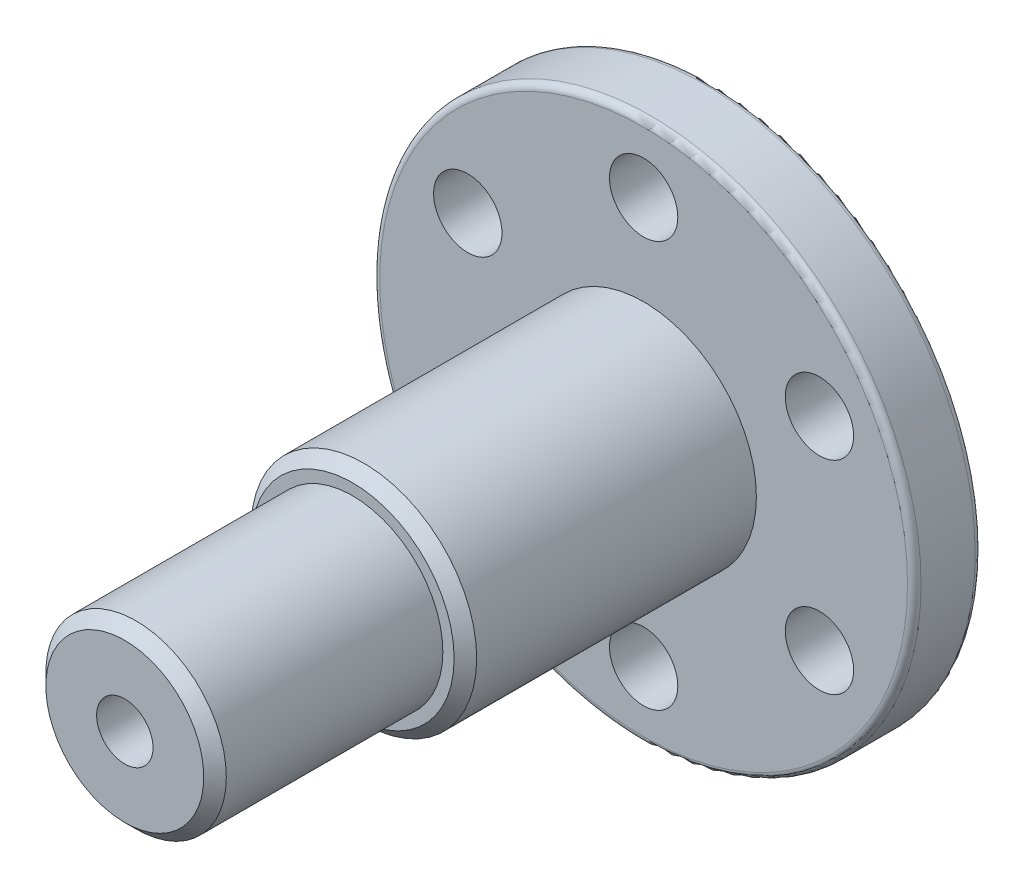
ISO-10303-21;
HEADER;
FILE_DESCRIPTION(('STEP AP214'),'2;1');
FILE_NAME('part.step','',(''),(''),'','','');
FILE_SCHEMA(('AUTOMOTIVE_DESIGN { 1 0 10303 214 1 1 1 1 }'));
ENDSEC;
DATA;
#1=APPLICATION_CONTEXT('core data for automotive mechanical design processes');
#2=APPLICATION_PROTOCOL_DEFINITION('international standard','automotive_design',2000,#1);
#3=PRODUCT_CONTEXT('',#1,'mechanical');
#4=PRODUCT('Part','Part','',(#3));
#5=PRODUCT_RELATED_PRODUCT_CATEGORY('part','',(#4));
#6=PRODUCT_DEFINITION_FORMATION('','',#4);
#7=PRODUCT_DEFINITION_CONTEXT('part definition',#1,'design');
#8=PRODUCT_DEFINITION('design','',#6,#7);
#9=PRODUCT_DEFINITION_SHAPE('','',#8);
#10=(LENGTH_UNIT() NAMED_UNIT(*) SI_UNIT(.MILLI.,.METRE.));
#11=(NAMED_UNIT(*) PLANE_ANGLE_UNIT() SI_UNIT($,.RADIAN.));
#12=(NAMED_UNIT(*) SI_UNIT($,.STERADIAN.) SOLID_ANGLE_UNIT());
#13=UNCERTAINTY_MEASURE_WITH_UNIT(LENGTH_MEASURE(1.E-05),#10,'distance_accuracy_value','');
#14=(GEOMETRIC_REPRESENTATION_CONTEXT(3) GLOBAL_UNCERTAINTY_ASSIGNED_CONTEXT((#13)) GLOBAL_UNIT_ASSIGNED_CONTEXT((#10,
#11,#12)) REPRESENTATION_CONTEXT('',''));
#15=CARTESIAN_POINT('',(0.,0.,0.));
#16=DIRECTION('',(0.,0.,1.));
#17=DIRECTION('',(1.,0.,0.));
#18=AXIS2_PLACEMENT_3D('',#15,#16,#17);
#19=CARTESIAN_POINT('',(0.,0.,26.));
#20=DIRECTION('',(0.,0.,-1.));
#21=DIRECTION('',(-1.,0.,0.));
#22=AXIS2_PLACEMENT_3D('',#19,#20,#21);
#23=CYLINDRICAL_SURFACE('',#22,5.);
#24=CARTESIAN_POINT('',(0.,0.,15.4));
#25=DIRECTION('',(0.,0.,1.));
#26=DIRECTION('',(1.,0.,0.));
#27=AXIS2_PLACEMENT_3D('',#24,#25,#26);
#28=CIRCLE('',#27,5.);
#29=CARTESIAN_POINT('',(5.,0.,15.4));
#30=VERTEX_POINT('',#29);
#31=EDGE_CURVE('E116',#30,#30,#28,.F.);
#32=ORIENTED_EDGE('',*,*,#31,.T.);
#33=EDGE_LOOP('',(#32));
#34=FACE_BOUND('',#33,.T.);
#35=CARTESIAN_POINT('',(0.,0.,3.));
#36=DIRECTION('',(0.,0.,1.));
#37=DIRECTION('',(1.,0.,0.));
#38=AXIS2_PLACEMENT_3D('',#35,#36,#37);
#39=CIRCLE('',#38,5.);
#40=CARTESIAN_POINT('',(5.,0.,3.));
#41=VERTEX_POINT('',#40);
#42=EDGE_CURVE('E70',#41,#41,#39,.T.);
#43=ORIENTED_EDGE('',*,*,#42,.T.);
#44=EDGE_LOOP('',(#43));
#45=FACE_BOUND('',#44,.T.);
#46=ADVANCED_FACE('F47',(#34,#45),#23,.T.);
#47=CARTESIAN_POINT('',(0.,0.,3.));
#48=DIRECTION('',(0.,0.,1.));
#49=DIRECTION('',(1.,0.,0.));
#50=AXIS2_PLACEMENT_3D('',#47,#48,#49);
#51=PLANE('',#50);
#52=CARTESIAN_POINT('',(0.,0.,3.));
#53=DIRECTION('',(0.,0.,1.));
#54=DIRECTION('',(1.,0.,0.));
#55=AXIS2_PLACEMENT_3D('',#52,#53,#54);
#56=CIRCLE('',#55,11.7);
#57=CARTESIAN_POINT('',(11.7,0.,3.));
#58=VERTEX_POINT('',#57);
#59=EDGE_CURVE('E13',#58,#58,#56,.T.);
#60=ORIENTED_EDGE('',*,*,#59,.T.);
#61=EDGE_LOOP('',(#60));
#62=FACE_BOUND('',#61,.T.);
#63=ORIENTED_EDGE('',*,*,#42,.F.);
#64=EDGE_LOOP('',(#63));
#65=FACE_BOUND('',#64,.T.);
#66=CARTESIAN_POINT('',(-7.79422863405995,-4.5,3.));
#67=DIRECTION('',(0.,0.,1.));
#68=DIRECTION('',(1.,0.,0.));
#69=AXIS2_PLACEMENT_3D('',#66,#67,#68);
#70=CIRCLE('',#69,1.5149999999998);
#71=CARTESIAN_POINT('',(-6.27922863406015,-4.5,3.));
#72=VERTEX_POINT('',#71);
#73=EDGE_CURVE('E84',#72,#72,#70,.T.);
#74=ORIENTED_EDGE('',*,*,#73,.F.);
#75=EDGE_LOOP('',(#74));
#76=FACE_BOUND('',#75,.T.);
#77=CARTESIAN_POINT('',(7.79422863405986,-4.50000000000014,3.));
#78=DIRECTION('',(0.,0.,1.));
#79=DIRECTION('',(1.,0.,0.));
#80=AXIS2_PLACEMENT_3D('',#77,#78,#79);
#81=CIRCLE('',#80,1.515);
#82=CARTESIAN_POINT('',(9.30922863405986,-4.50000000000014,3.));
#83=VERTEX_POINT('',#82);
#84=EDGE_CURVE('E96',#83,#83,#81,.T.);
#85=ORIENTED_EDGE('',*,*,#84,.F.);
#86=EDGE_LOOP('',(#85));
#87=FACE_BOUND('',#86,.T.);
#88=CARTESIAN_POINT('',(0.,9.,3.));
#89=DIRECTION('',(0.,0.,1.));
#90=DIRECTION('',(1.,0.,0.));
#91=AXIS2_PLACEMENT_3D('',#88,#89,#90);
#92=CIRCLE('',#91,1.515);
#93=CARTESIAN_POINT('',(1.515,9.,3.));
#94=VERTEX_POINT('',#93);
#95=EDGE_CURVE('E108',#94,#94,#92,.T.);
#96=ORIENTED_EDGE('',*,*,#95,.F.);
#97=EDGE_LOOP('',(#96));
#98=FACE_BOUND('',#97,.T.);
#99=CARTESIAN_POINT('',(7.79422863406002,4.49999999999987,3.));
#100=DIRECTION('',(0.,0.,1.));
#101=DIRECTION('',(1.,0.,0.));
#102=AXIS2_PLACEMENT_3D('',#99,#100,#101);
#103=CIRCLE('',#102,1.515);
#104=CARTESIAN_POINT('',(9.30922863406002,4.49999999999987,3.));
#105=VERTEX_POINT('',#104);
#106=EDGE_CURVE('E102',#105,#105,#103,.T.);
#107=ORIENTED_EDGE('',*,*,#106,.F.);
#108=EDGE_LOOP('',(#107));
#109=FACE_BOUND('',#108,.T.);
#110=CARTESIAN_POINT('',(-1.87350135405495E-13,-9.,3.));
#111=DIRECTION('',(0.,0.,1.));
#112=DIRECTION('',(1.,0.,0.));
#113=AXIS2_PLACEMENT_3D('',#110,#111,#112);
#114=CIRCLE('',#113,1.515);
#115=CARTESIAN_POINT('',(1.51499999999981,-9.,3.));
#116=VERTEX_POINT('',#115);
#117=EDGE_CURVE('E90',#116,#116,#114,.T.);
#118=ORIENTED_EDGE('',*,*,#117,.F.);
#119=EDGE_LOOP('',(#118));
#120=FACE_BOUND('',#119,.T.);
#121=CARTESIAN_POINT('',(-7.7942286340599,4.50000000000009,3.));
#122=DIRECTION('',(0.,0.,1.));
#123=DIRECTION('',(1.,0.,0.));
#124=AXIS2_PLACEMENT_3D('',#121,#122,#123);
#125=CIRCLE('',#124,1.515);
#126=CARTESIAN_POINT('',(-6.2792286340599,4.50000000000009,3.));
#127=VERTEX_POINT('',#126);
#128=EDGE_CURVE('E78',#127,#127,#125,.T.);
#129=ORIENTED_EDGE('',*,*,#128,.F.);
#130=EDGE_LOOP('',(#129));
#131=FACE_BOUND('',#130,.T.);
#132=ADVANCED_FACE('F153',(#62,#65,#76,#87,#98,#109,#120,#131),#51,.T.);
#133=CARTESIAN_POINT('',(0.,0.,0.));
#134=DIRECTION('',(0.,0.,1.));
#135=DIRECTION('',(1.,0.,0.));
#136=AXIS2_PLACEMENT_3D('',#133,#134,#135);
#137=PLANE('',#136);
#138=CARTESIAN_POINT('',(0.,0.,0.));
#139=DIRECTION('',(0.,0.,1.));
#140=DIRECTION('',(1.,0.,0.));
#141=AXIS2_PLACEMENT_3D('',#138,#139,#140);
#142=CIRCLE('',#141,11.7);
#143=CARTESIAN_POINT('',(11.7,0.,0.));
#144=VERTEX_POINT('',#143);
#145=EDGE_CURVE('E54',#144,#144,#142,.F.);
#146=ORIENTED_EDGE('',*,*,#145,.T.);
#147=EDGE_LOOP('',(#146));
#148=FACE_BOUND('',#147,.T.);
#149=CARTESIAN_POINT('',(0.,9.,0.));
#150=DIRECTION('',(0.,0.,1.));
#151=DIRECTION('',(1.,0.,0.));
#152=AXIS2_PLACEMENT_3D('',#149,#150,#151);
#153=CIRCLE('',#152,1.515);
#154=CARTESIAN_POINT('',(1.515,9.,0.));
#155=VERTEX_POINT('',#154);
#156=EDGE_CURVE('E105',#155,#155,#153,.T.);
#157=ORIENTED_EDGE('',*,*,#156,.T.);
#158=EDGE_LOOP('',(#157));
#159=FACE_BOUND('',#158,.T.);
#160=CARTESIAN_POINT('',(7.79422863406002,4.49999999999987,0.));
#161=DIRECTION('',(0.,0.,1.));
#162=DIRECTION('',(1.,0.,0.));
#163=AXIS2_PLACEMENT_3D('',#160,#161,#162);
#164=CIRCLE('',#163,1.515);
#165=CARTESIAN_POINT('',(9.30922863406002,4.49999999999987,0.));
#166=VERTEX_POINT('',#165);
#167=EDGE_CURVE('E99',#166,#166,#164,.T.);
#168=ORIENTED_EDGE('',*,*,#167,.T.);
#169=EDGE_LOOP('',(#168));
#170=FACE_BOUND('',#169,.T.);
#171=CARTESIAN_POINT('',(7.79422863405986,-4.50000000000014,0.));
#172=DIRECTION('',(0.,0.,1.));
#173=DIRECTION('',(1.,0.,0.));
#174=AXIS2_PLACEMENT_3D('',#171,#172,#173);
#175=CIRCLE('',#174,1.515);
#176=CARTESIAN_POINT('',(9.30922863405986,-4.50000000000014,0.));
#177=VERTEX_POINT('',#176);
#178=EDGE_CURVE('E93',#177,#177,#175,.T.);
#179=ORIENTED_EDGE('',*,*,#178,.T.);
#180=EDGE_LOOP('',(#179));
#181=FACE_BOUND('',#180,.T.);
#182=CARTESIAN_POINT('',(-1.87350135405495E-13,-9.,0.));
#183=DIRECTION('',(0.,0.,1.));
#184=DIRECTION('',(1.,0.,0.));
#185=AXIS2_PLACEMENT_3D('',#182,#183,#184);
#186=CIRCLE('',#185,1.515);
#187=CARTESIAN_POINT('',(1.51499999999981,-9.,0.));
#188=VERTEX_POINT('',#187);
#189=EDGE_CURVE('E87',#188,#188,#186,.T.);
#190=ORIENTED_EDGE('',*,*,#189,.T.);
#191=EDGE_LOOP('',(#190));
#192=FACE_BOUND('',#191,.T.);
#193=CARTESIAN_POINT('',(-7.79422863405995,-4.5,0.));
#194=DIRECTION('',(0.,0.,1.));
#195=DIRECTION('',(1.,0.,0.));
#196=AXIS2_PLACEMENT_3D('',#193,#194,#195);
#197=CIRCLE('',#196,1.5149999999998);
#198=CARTESIAN_POINT('',(-6.27922863406015,-4.5,0.));
#199=VERTEX_POINT('',#198);
#200=EDGE_CURVE('E81',#199,#199,#197,.T.);
#201=ORIENTED_EDGE('',*,*,#200,.T.);
#202=EDGE_LOOP('',(#201));
#203=FACE_BOUND('',#202,.T.);
#204=CARTESIAN_POINT('',(-7.7942286340599,4.50000000000009,0.));
#205=DIRECTION('',(0.,0.,1.));
#206=DIRECTION('',(1.,0.,0.));
#207=AXIS2_PLACEMENT_3D('',#204,#205,#206);
#208=CIRCLE('',#207,1.515);
#209=CARTESIAN_POINT('',(-6.2792286340599,4.50000000000009,0.));
#210=VERTEX_POINT('',#209);
#211=EDGE_CURVE('E77',#210,#210,#208,.T.);
#212=ORIENTED_EDGE('',*,*,#211,.T.);
#213=EDGE_LOOP('',(#212));
#214=FACE_BOUND('',#213,.T.);
#215=ADVANCED_FACE('F133',(#148,#159,#170,#181,#192,#203,#214),#137,.F.);
#216=CARTESIAN_POINT('',(0.,0.,3.));
#217=DIRECTION('',(0.,0.,-1.));
#218=DIRECTION('',(-1.,0.,0.));
#219=AXIS2_PLACEMENT_3D('',#216,#217,#218);
#220=CYLINDRICAL_SURFACE('',#219,12.);
#221=CARTESIAN_POINT('',(0.,0.,0.3));
#222=DIRECTION('',(0.,0.,1.));
#223=DIRECTION('',(1.,0.,0.));
#224=AXIS2_PLACEMENT_3D('',#221,#222,#223);
#225=CIRCLE('',#224,12.);
#226=CARTESIAN_POINT('',(12.,0.,0.3));
#227=VERTEX_POINT('',#226);
#228=EDGE_CURVE('E128',#227,#227,#225,.T.);
#229=ORIENTED_EDGE('',*,*,#228,.T.);
#230=EDGE_LOOP('',(#229));
#231=FACE_BOUND('',#230,.T.);
#232=CARTESIAN_POINT('',(0.,0.,2.7));
#233=DIRECTION('',(0.,0.,1.));
#234=DIRECTION('',(1.,0.,0.));
#235=AXIS2_PLACEMENT_3D('',#232,#233,#234);
#236=CIRCLE('',#235,12.);
#237=CARTESIAN_POINT('',(12.,0.,2.7));
#238=VERTEX_POINT('',#237);
#239=EDGE_CURVE('E125',#238,#238,#236,.F.);
#240=ORIENTED_EDGE('',*,*,#239,.T.);
#241=EDGE_LOOP('',(#240));
#242=FACE_BOUND('',#241,.T.);
#243=ADVANCED_FACE('F142',(#231,#242),#220,.T.);
#244=CARTESIAN_POINT('',(0.,9.,3.));
#245=DIRECTION('',(0.,0.,-1.));
#246=DIRECTION('',(-1.,0.,0.));
#247=AXIS2_PLACEMENT_3D('',#244,#245,#246);
#248=CYLINDRICAL_SURFACE('',#247,1.515);
#249=ORIENTED_EDGE('',*,*,#95,.T.);
#250=EDGE_LOOP('',(#249));
#251=FACE_BOUND('',#250,.T.);
#252=ORIENTED_EDGE('',*,*,#156,.F.);
#253=EDGE_LOOP('',(#252));
#254=FACE_BOUND('',#253,.T.);
#255=ADVANCED_FACE('F145',(#251,#254),#248,.F.);
#256=CARTESIAN_POINT('',(7.79422863406002,4.49999999999987,3.));
#257=DIRECTION('',(0.,0.,-1.));
#258=DIRECTION('',(-1.,0.,0.));
#259=AXIS2_PLACEMENT_3D('',#256,#257,#258);
#260=CYLINDRICAL_SURFACE('',#259,1.515);
#261=ORIENTED_EDGE('',*,*,#106,.T.);
#262=EDGE_LOOP('',(#261));
#263=FACE_BOUND('',#262,.T.);
#264=ORIENTED_EDGE('',*,*,#167,.F.);
#265=EDGE_LOOP('',(#264));
#266=FACE_BOUND('',#265,.T.);
#267=ADVANCED_FACE('F203',(#263,#266),#260,.F.);
#268=CARTESIAN_POINT('',(7.79422863405986,-4.50000000000014,3.));
#269=DIRECTION('',(0.,0.,-1.));
#270=DIRECTION('',(-1.,0.,0.));
#271=AXIS2_PLACEMENT_3D('',#268,#269,#270);
#272=CYLINDRICAL_SURFACE('',#271,1.515);
#273=ORIENTED_EDGE('',*,*,#84,.T.);
#274=EDGE_LOOP('',(#273));
#275=FACE_BOUND('',#274,.T.);
#276=ORIENTED_EDGE('',*,*,#178,.F.);
#277=EDGE_LOOP('',(#276));
#278=FACE_BOUND('',#277,.T.);
#279=ADVANCED_FACE('F199',(#275,#278),#272,.F.);
#280=CARTESIAN_POINT('',(-1.87350135405495E-13,-9.,3.));
#281=DIRECTION('',(0.,0.,-1.));
#282=DIRECTION('',(-1.,0.,0.));
#283=AXIS2_PLACEMENT_3D('',#280,#281,#282);
#284=CYLINDRICAL_SURFACE('',#283,1.515);
#285=ORIENTED_EDGE('',*,*,#117,.T.);
#286=EDGE_LOOP('',(#285));
#287=FACE_BOUND('',#286,.T.);
#288=ORIENTED_EDGE('',*,*,#189,.F.);
#289=EDGE_LOOP('',(#288));
#290=FACE_BOUND('',#289,.T.);
#291=ADVANCED_FACE('F195',(#287,#290),#284,.F.);
#292=CARTESIAN_POINT('',(-7.79422863405995,-4.5,3.));
#293=DIRECTION('',(0.,0.,-1.));
#294=DIRECTION('',(-1.,0.,0.));
#295=AXIS2_PLACEMENT_3D('',#292,#293,#294);
#296=CYLINDRICAL_SURFACE('',#295,1.5149999999998);
#297=ORIENTED_EDGE('',*,*,#73,.T.);
#298=EDGE_LOOP('',(#297));
#299=FACE_BOUND('',#298,.T.);
#300=ORIENTED_EDGE('',*,*,#200,.F.);
#301=EDGE_LOOP('',(#300));
#302=FACE_BOUND('',#301,.T.);
#303=ADVANCED_FACE('F175',(#299,#302),#296,.F.);
#304=CARTESIAN_POINT('',(-7.7942286340599,4.50000000000009,3.));
#305=DIRECTION('',(0.,0.,-1.));
#306=DIRECTION('',(-1.,0.,0.));
#307=AXIS2_PLACEMENT_3D('',#304,#305,#306);
#308=CYLINDRICAL_SURFACE('',#307,1.515);
#309=ORIENTED_EDGE('',*,*,#128,.T.);
#310=EDGE_LOOP('',(#309));
#311=FACE_BOUND('',#310,.T.);
#312=ORIENTED_EDGE('',*,*,#211,.F.);
#313=EDGE_LOOP('',(#312));
#314=FACE_BOUND('',#313,.T.);
#315=ADVANCED_FACE('F171',(#311,#314),#308,.F.);
#316=CARTESIAN_POINT('',(0.,0.,15.9));
#317=DIRECTION('',(0.,0.,1.));
#318=DIRECTION('',(1.,0.,0.));
#319=AXIS2_PLACEMENT_3D('',#316,#317,#318);
#320=PLANE('',#319);
#321=CARTESIAN_POINT('',(0.,0.,15.9));
#322=DIRECTION('',(0.,0.,1.));
#323=DIRECTION('',(1.,0.,0.));
#324=AXIS2_PLACEMENT_3D('',#321,#322,#323);
#325=CIRCLE('',#324,4.5);
#326=CARTESIAN_POINT('',(4.5,0.,15.9));
#327=VERTEX_POINT('',#326);
#328=EDGE_CURVE('E111',#327,#327,#325,.T.);
#329=ORIENTED_EDGE('',*,*,#328,.T.);
#330=EDGE_LOOP('',(#329));
#331=FACE_BOUND('',#330,.T.);
#332=CARTESIAN_POINT('',(0.,0.,15.9));
#333=DIRECTION('',(0.,0.,1.));
#334=DIRECTION('',(1.,0.,0.));
#335=AXIS2_PLACEMENT_3D('',#332,#333,#334);
#336=CIRCLE('',#335,4.);
#337=CARTESIAN_POINT('',(4.,0.,15.9));
#338=VERTEX_POINT('',#337);
#339=EDGE_CURVE('E66',#338,#338,#336,.F.);
#340=ORIENTED_EDGE('',*,*,#339,.T.);
#341=EDGE_LOOP('',(#340));
#342=FACE_BOUND('',#341,.T.);
#343=ADVANCED_FACE('F174',(#331,#342),#320,.T.);
#344=CARTESIAN_POINT('',(0.,0.,-31.2805367519238));
#345=DIRECTION('',(0.,0.,1.));
#346=DIRECTION('',(1.,0.,0.));
#347=AXIS2_PLACEMENT_3D('',#344,#345,#346);
#348=CYLINDRICAL_SURFACE('',#347,4.);
#349=CARTESIAN_POINT('',(0.,0.,25.5));
#350=DIRECTION('',(0.,0.,1.));
#351=DIRECTION('',(1.,0.,0.));
#352=AXIS2_PLACEMENT_3D('',#349,#350,#351);
#353=CIRCLE('',#352,4.);
#354=CARTESIAN_POINT('',(4.,0.,25.5));
#355=VERTEX_POINT('',#354);
#356=EDGE_CURVE('E122',#355,#355,#353,.F.);
#357=CARTESIAN_POINT('',(4.,0.,25.5));
#358=CARTESIAN_POINT('',(4.,0.,25.4));
#359=CARTESIAN_POINT('',(4.,0.,25.3));
#360=CARTESIAN_POINT('',(4.,0.,25.1));
#361=CARTESIAN_POINT('',(4.,0.,25.));
#362=CARTESIAN_POINT('',(4.,0.,24.8));
#363=CARTESIAN_POINT('',(4.,0.,24.7));
#364=CARTESIAN_POINT('',(4.,0.,24.5));
#365=CARTESIAN_POINT('',(4.,0.,24.4));
#366=CARTESIAN_POINT('',(4.,0.,24.2));
#367=CARTESIAN_POINT('',(4.,0.,24.1));
#368=CARTESIAN_POINT('',(4.,0.,23.9));
#369=CARTESIAN_POINT('',(4.,0.,23.8));
#370=CARTESIAN_POINT('',(4.,0.,23.6));
#371=CARTESIAN_POINT('',(4.,0.,23.5));
#372=CARTESIAN_POINT('',(4.,0.,23.3));
#373=CARTESIAN_POINT('',(4.,0.,23.2));
#374=CARTESIAN_POINT('',(4.,0.,23.));
#375=CARTESIAN_POINT('',(4.,0.,22.9));
#376=CARTESIAN_POINT('',(4.,0.,22.7));
#377=CARTESIAN_POINT('',(4.,0.,22.6));
#378=CARTESIAN_POINT('',(4.,0.,22.4));
#379=CARTESIAN_POINT('',(4.,0.,22.3));
#380=CARTESIAN_POINT('',(4.,0.,22.1));
#381=CARTESIAN_POINT('',(4.,0.,22.));
#382=CARTESIAN_POINT('',(4.,0.,21.8));
#383=CARTESIAN_POINT('',(4.,0.,21.7));
#384=CARTESIAN_POINT('',(4.,0.,21.5));
#385=CARTESIAN_POINT('',(4.,0.,21.4));
#386=CARTESIAN_POINT('',(4.,0.,21.2));
#387=CARTESIAN_POINT('',(4.,0.,21.1));
#388=CARTESIAN_POINT('',(4.,0.,20.9));
#389=CARTESIAN_POINT('',(4.,0.,20.8));
#390=CARTESIAN_POINT('',(4.,0.,20.6));
#391=CARTESIAN_POINT('',(4.,0.,20.5));
#392=CARTESIAN_POINT('',(4.,0.,20.3));
#393=CARTESIAN_POINT('',(4.,0.,20.2));
#394=CARTESIAN_POINT('',(4.,0.,20.));
#395=CARTESIAN_POINT('',(4.,0.,19.9));
#396=CARTESIAN_POINT('',(4.,0.,19.7));
#397=CARTESIAN_POINT('',(4.,0.,19.6));
#398=CARTESIAN_POINT('',(4.,0.,19.4));
#399=CARTESIAN_POINT('',(4.,0.,19.3));
#400=CARTESIAN_POINT('',(4.,0.,19.1));
#401=CARTESIAN_POINT('',(4.,0.,19.));
#402=CARTESIAN_POINT('',(4.,0.,18.8));
#403=CARTESIAN_POINT('',(4.,0.,18.7));
#404=CARTESIAN_POINT('',(4.,0.,18.5));
#405=CARTESIAN_POINT('',(4.,0.,18.4));
#406=CARTESIAN_POINT('',(4.,0.,18.2));
#407=CARTESIAN_POINT('',(4.,0.,18.1));
#408=CARTESIAN_POINT('',(4.,0.,17.9));
#409=CARTESIAN_POINT('',(4.,0.,17.8));
#410=CARTESIAN_POINT('',(4.,0.,17.6));
#411=CARTESIAN_POINT('',(4.,0.,17.5));
#412=CARTESIAN_POINT('',(4.,0.,17.3));
#413=CARTESIAN_POINT('',(4.,0.,17.2));
#414=CARTESIAN_POINT('',(4.,0.,17.));
#415=CARTESIAN_POINT('',(4.,0.,16.9));
#416=CARTESIAN_POINT('',(4.,0.,16.7));
#417=CARTESIAN_POINT('',(4.,0.,16.6));
#418=CARTESIAN_POINT('',(4.,0.,16.4));
#419=CARTESIAN_POINT('',(4.,0.,16.3));
#420=CARTESIAN_POINT('',(4.,0.,16.1));
#421=CARTESIAN_POINT('',(4.,0.,16.));
#422=CARTESIAN_POINT('',(4.,0.,15.9));
#423=B_SPLINE_CURVE_WITH_KNOTS('',3,(#357,#358,#359,#360,#361,#362,#363,#364,#365,#366,#367,
#368,#369,#370,#371,#372,#373,#374,#375,#376,#377,#378,#379,#380,#381,#382,#383,#384,#385,#386,
#387,#388,#389,#390,#391,#392,#393,#394,#395,#396,#397,#398,#399,#400,#401,#402,#403,#404,#405,
#406,#407,#408,#409,#410,#411,#412,#413,#414,#415,#416,#417,#418,#419,#420,#421,#422),
.UNSPECIFIED.,.F.,.F.,(4,2,2,2,2,2,2,2,2,2,2,2,2,2,2,2,2,2,2,2,2,2,2,2,2,2,2,2,2,2,2,2,4),(0.,
0.300000000000002,0.600000000000003,0.899999999999998,1.2,1.5,1.8,2.1,2.4,2.7,3.,3.3,3.6,3.9,
4.2,4.5,4.8,5.1,5.4,5.7,6.,6.3,6.59999999999999,6.9,7.2,7.5,7.8,8.1,8.4,8.7,8.99999999999999,
9.3,9.6),.UNSPECIFIED.);
#424=EDGE_CURVE('BSEAM254',#355,#338,#423,.T.);
#425=ORIENTED_EDGE('',*,*,#356,.T.);
#426=ORIENTED_EDGE('',*,*,#339,.F.);
#427=ORIENTED_EDGE('',*,*,#424,.T.);
#428=ORIENTED_EDGE('',*,*,#424,.F.);
#429=EDGE_LOOP('',(#425,#427,#426,#428));
#430=FACE_BOUND('',#429,.T.);
#431=ADVANCED_FACE('F254',(#430),#348,.T.);
#432=CARTESIAN_POINT('',(0.,0.,26.));
#433=DIRECTION('',(0.,0.,1.));
#434=DIRECTION('',(1.,0.,0.));
#435=AXIS2_PLACEMENT_3D('',#432,#433,#434);
#436=PLANE('',#435);
#437=CARTESIAN_POINT('',(0.,0.,26.));
#438=DIRECTION('',(0.,0.,1.));
#439=DIRECTION('',(1.,0.,0.));
#440=AXIS2_PLACEMENT_3D('',#437,#438,#439);
#441=CIRCLE('',#440,1.24999999999999);
#442=CARTESIAN_POINT('',(1.24999999999999,0.,26.));
#443=VERTEX_POINT('',#442);
#444=EDGE_CURVE('E67',#443,#443,#441,.T.);
#445=ORIENTED_EDGE('',*,*,#444,.F.);
#446=EDGE_LOOP('',(#445));
#447=FACE_BOUND('',#446,.T.);
#448=CARTESIAN_POINT('',(0.,0.,26.));
#449=DIRECTION('',(0.,0.,1.));
#450=DIRECTION('',(1.,0.,0.));
#451=AXIS2_PLACEMENT_3D('',#448,#449,#450);
#452=CIRCLE('',#451,3.5);
#453=CARTESIAN_POINT('',(3.5,0.,26.));
#454=VERTEX_POINT('',#453);
#455=EDGE_CURVE('E119',#454,#454,#452,.T.);
#456=ORIENTED_EDGE('',*,*,#455,.T.);
#457=EDGE_LOOP('',(#456));
#458=FACE_BOUND('',#457,.T.);
#459=ADVANCED_FACE('F190',(#447,#458),#436,.T.);
#460=CARTESIAN_POINT('',(0.,0.,15.9));
#461=DIRECTION('',(0.,0.,-1.));
#462=DIRECTION('',(-1.,0.,0.));
#463=AXIS2_PLACEMENT_3D('',#460,#461,#462);
#464=CONICAL_SURFACE('',#463,4.5,0.785398163397447);
#465=ORIENTED_EDGE('',*,*,#31,.F.);
#466=EDGE_LOOP('',(#465));
#467=FACE_BOUND('',#466,.T.);
#468=ORIENTED_EDGE('',*,*,#328,.F.);
#469=EDGE_LOOP('',(#468));
#470=FACE_BOUND('',#469,.T.);
#471=ADVANCED_FACE('F269',(#467,#470),#464,.T.);
#472=CARTESIAN_POINT('',(0.,0.,26.));
#473=DIRECTION('',(0.,0.,-1.));
#474=DIRECTION('',(-1.,0.,0.));
#475=AXIS2_PLACEMENT_3D('',#472,#473,#474);
#476=CONICAL_SURFACE('',#475,3.5,0.785398163397446);
#477=ORIENTED_EDGE('',*,*,#356,.F.);
#478=EDGE_LOOP('',(#477));
#479=FACE_BOUND('',#478,.T.);
#480=ORIENTED_EDGE('',*,*,#455,.F.);
#481=EDGE_LOOP('',(#480));
#482=FACE_BOUND('',#481,.T.);
#483=ADVANCED_FACE('F139',(#479,#482),#476,.T.);
#484=CARTESIAN_POINT('',(0.,0.,0.3));
#485=DIRECTION('',(0.,0.,1.));
#486=DIRECTION('',(1.,0.,0.));
#487=AXIS2_PLACEMENT_3D('',#484,#485,#486);
#488=TOROIDAL_SURFACE('',#487,11.7,0.3);
#489=ORIENTED_EDGE('',*,*,#145,.F.);
#490=EDGE_LOOP('',(#489));
#491=FACE_BOUND('',#490,.T.);
#492=ORIENTED_EDGE('',*,*,#228,.F.);
#493=EDGE_LOOP('',(#492));
#494=FACE_BOUND('',#493,.T.);
#495=ADVANCED_FACE('F136',(#491,#494),#488,.T.);
#496=CARTESIAN_POINT('',(0.,0.,2.7));
#497=DIRECTION('',(0.,0.,1.));
#498=DIRECTION('',(1.,0.,0.));
#499=AXIS2_PLACEMENT_3D('',#496,#497,#498);
#500=TOROIDAL_SURFACE('',#499,11.7,0.3);
#501=ORIENTED_EDGE('',*,*,#239,.F.);
#502=EDGE_LOOP('',(#501));
#503=FACE_BOUND('',#502,.T.);
#504=ORIENTED_EDGE('',*,*,#59,.F.);
#505=EDGE_LOOP('',(#504));
#506=FACE_BOUND('',#505,.T.);
#507=ADVANCED_FACE('F49',(#503,#506),#500,.T.);
#508=CARTESIAN_POINT('',(0.,0.,16.5));
#509=DIRECTION('',(0.,0.,1.));
#510=DIRECTION('',(1.,0.,0.));
#511=AXIS2_PLACEMENT_3D('',#508,#509,#510);
#512=CONICAL_SURFACE('',#511,1.25,1.02974425867665);
#513=CARTESIAN_POINT('',(0.,0.,15.7489242262155));
#514=VERTEX_POINT('',#513);
#515=VERTEX_LOOP('',#514);
#516=FACE_BOUND('',#515,.T.);
#517=CARTESIAN_POINT('',(0.,0.,16.5));
#518=DIRECTION('',(0.,0.,1.));
#519=DIRECTION('',(1.,0.,0.));
#520=AXIS2_PLACEMENT_3D('',#517,#518,#519);
#521=CIRCLE('',#520,1.25);
#522=CARTESIAN_POINT('',(1.25,0.,16.5));
#523=VERTEX_POINT('',#522);
#524=EDGE_CURVE('E64',#523,#523,#521,.T.);
#525=ORIENTED_EDGE('',*,*,#524,.T.);
#526=EDGE_LOOP('',(#525));
#527=FACE_BOUND('',#526,.T.);
#528=ADVANCED_FACE('F57',(#516,#527),#512,.F.);
#529=CARTESIAN_POINT('',(0.,0.,26.));
#530=DIRECTION('',(0.,0.,1.));
#531=DIRECTION('',(1.,0.,0.));
#532=AXIS2_PLACEMENT_3D('',#529,#530,#531);
#533=CYLINDRICAL_SURFACE('',#532,1.24999999999999);
#534=ORIENTED_EDGE('',*,*,#524,.F.);
#535=EDGE_LOOP('',(#534));
#536=FACE_BOUND('',#535,.T.);
#537=ORIENTED_EDGE('',*,*,#444,.T.);
#538=EDGE_LOOP('',(#537));
#539=FACE_BOUND('',#538,.T.);
#540=ADVANCED_FACE('F60',(#536,#539),#533,.F.);
#541=CLOSED_SHELL('',(#46,#132,#215,#243,#255,#267,#279,#291,#303,#315,#343,#431,#459,#471,#483,
#495,#507,#528,#540));
#542=MANIFOLD_SOLID_BREP('B2',#541);
#543=ADVANCED_BREP_SHAPE_REPRESENTATION('',(#18,#542),#14);
#544=SHAPE_DEFINITION_REPRESENTATION(#9,#543);
ENDSEC;
END-ISO-10303-21;
